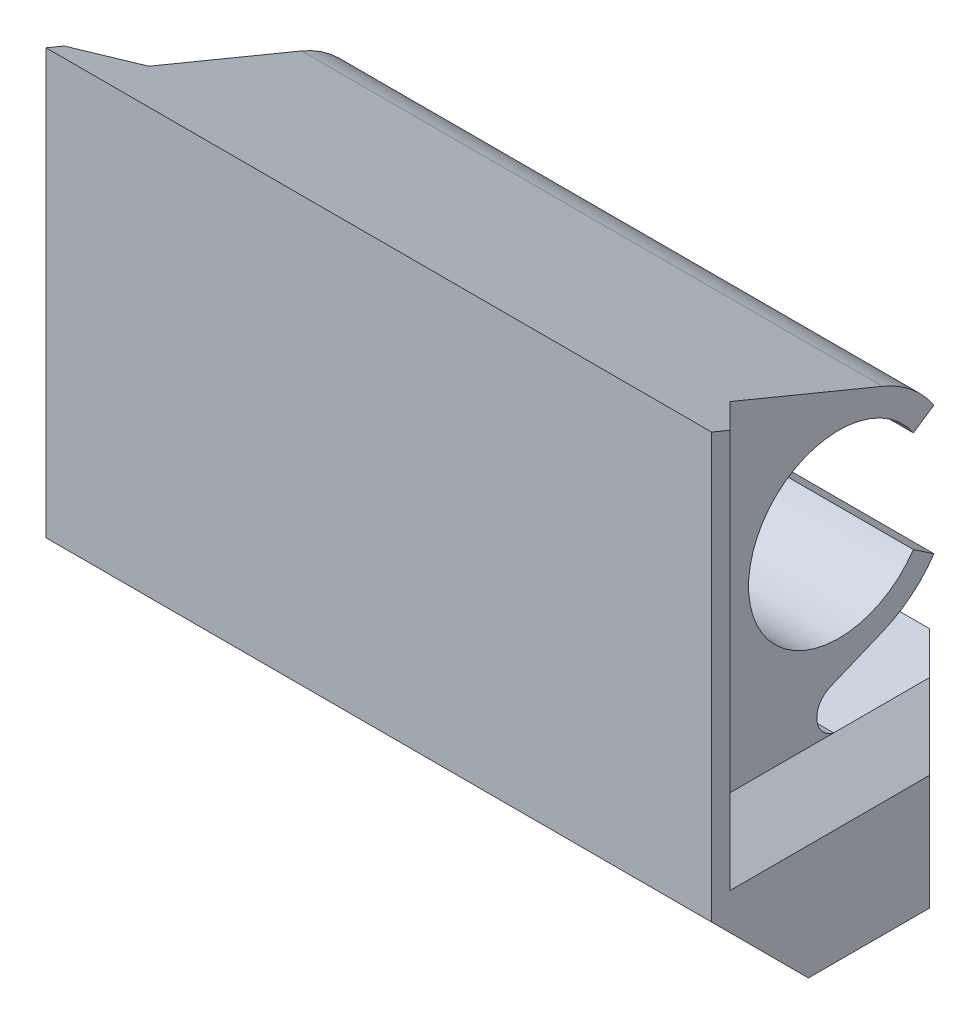
ISO-10303-21;
HEADER;
FILE_DESCRIPTION(('STEP AP214'),'2;1');
FILE_NAME('part.step','',(''),(''),'','','');
FILE_SCHEMA(('AUTOMOTIVE_DESIGN { 1 0 10303 214 1 1 1 1 }'));
ENDSEC;
DATA;
#1=APPLICATION_CONTEXT('core data for automotive mechanical design processes');
#2=APPLICATION_PROTOCOL_DEFINITION('international standard','automotive_design',2000,#1);
#3=PRODUCT_CONTEXT('',#1,'mechanical');
#4=PRODUCT('Part','Part','',(#3));
#5=PRODUCT_RELATED_PRODUCT_CATEGORY('part','',(#4));
#6=PRODUCT_DEFINITION_FORMATION('','',#4);
#7=PRODUCT_DEFINITION_CONTEXT('part definition',#1,'design');
#8=PRODUCT_DEFINITION('design','',#6,#7);
#9=PRODUCT_DEFINITION_SHAPE('','',#8);
#10=(LENGTH_UNIT() NAMED_UNIT(*) SI_UNIT(.MILLI.,.METRE.));
#11=(NAMED_UNIT(*) PLANE_ANGLE_UNIT() SI_UNIT($,.RADIAN.));
#12=(NAMED_UNIT(*) SI_UNIT($,.STERADIAN.) SOLID_ANGLE_UNIT());
#13=UNCERTAINTY_MEASURE_WITH_UNIT(LENGTH_MEASURE(1.E-05),#10,'distance_accuracy_value','');
#14=(GEOMETRIC_REPRESENTATION_CONTEXT(3) GLOBAL_UNCERTAINTY_ASSIGNED_CONTEXT((#13)) GLOBAL_UNIT_ASSIGNED_CONTEXT((#10,
#11,#12)) REPRESENTATION_CONTEXT('',''));
#15=CARTESIAN_POINT('',(0.,0.,0.));
#16=DIRECTION('',(0.,0.,1.));
#17=DIRECTION('',(1.,0.,0.));
#18=AXIS2_PLACEMENT_3D('',#15,#16,#17);
#19=CARTESIAN_POINT('',(41.1457740364154,20.7795206516653,-8.99999999999999));
#20=DIRECTION('',(-1.,0.,0.));
#21=DIRECTION('',(0.,0.,1.));
#22=AXIS2_PLACEMENT_3D('',#19,#20,#21);
#23=CYLINDRICAL_SURFACE('',#22,7.45);
#24=DIRECTION('',(-1.,0.,0.));
#25=VECTOR('',#24,1.);
#26=CARTESIAN_POINT('',(41.1457740364154,16.6055910436871,-15.1709652103738));
#27=LINE('',#26,#25);
#28=CARTESIAN_POINT('',(41.1457740364154,16.6055910436871,-15.1709652103738));
#29=VERTEX_POINT('',#28);
#30=CARTESIAN_POINT('',(-3.85422596358456,16.6055910436871,-15.1709652103738));
#31=VERTEX_POINT('',#30);
#32=EDGE_CURVE('E286',#29,#31,#27,.T.);
#33=ORIENTED_EDGE('',*,*,#32,.T.);
#34=CARTESIAN_POINT('',(-3.85422596358456,20.7795206516653,-8.99999999999999));
#35=DIRECTION('',(-1.,0.,0.));
#36=DIRECTION('',(0.,0.,1.));
#37=AXIS2_PLACEMENT_3D('',#34,#35,#36);
#38=CIRCLE('',#37,7.45);
#39=CARTESIAN_POINT('',(-3.85422596358456,24.9534502596434,-15.1709652103738));
#40=VERTEX_POINT('',#39);
#41=EDGE_CURVE('E198',#31,#40,#38,.T.);
#42=ORIENTED_EDGE('',*,*,#41,.T.);
#43=DIRECTION('',(-1.,0.,0.));
#44=VECTOR('',#43,1.);
#45=CARTESIAN_POINT('',(41.1457740364154,24.9534502596434,-15.1709652103738));
#46=LINE('',#45,#44);
#47=CARTESIAN_POINT('',(41.1457740364154,24.9534502596434,-15.1709652103738));
#48=VERTEX_POINT('',#47);
#49=EDGE_CURVE('E288',#48,#40,#46,.T.);
#50=ORIENTED_EDGE('',*,*,#49,.F.);
#51=CARTESIAN_POINT('',(41.1457740364154,20.7795206516653,-8.99999999999999));
#52=DIRECTION('',(1.,0.,0.));
#53=DIRECTION('',(0.,0.,1.));
#54=AXIS2_PLACEMENT_3D('',#51,#52,#53);
#55=CIRCLE('',#54,7.45);
#56=EDGE_CURVE('E239',#48,#29,#55,.T.);
#57=ORIENTED_EDGE('',*,*,#56,.T.);
#58=EDGE_LOOP('',(#33,#42,#50,#57));
#59=FACE_BOUND('',#58,.T.);
#60=ADVANCED_FACE('F33',(#59),#23,.F.);
#61=CARTESIAN_POINT('',(44.6457740364154,6.77952065166529,-20.));
#62=DIRECTION('',(0.,1.,0.));
#63=DIRECTION('',(0.,0.,1.));
#64=AXIS2_PLACEMENT_3D('',#61,#62,#63);
#65=PLANE('',#64);
#66=DIRECTION('',(0.,0.,-1.));
#67=VECTOR('',#66,1.);
#68=CARTESIAN_POINT('',(41.1457740364154,6.77952065166529,-20.));
#69=LINE('',#68,#67);
#70=CARTESIAN_POINT('',(41.1457740364154,6.77952065166529,-8.5764706950357));
#71=VERTEX_POINT('',#70);
#72=CARTESIAN_POINT('',(41.1457740364154,6.77952065166529,-16.5));
#73=VERTEX_POINT('',#72);
#74=EDGE_CURVE('E348',#71,#73,#69,.T.);
#75=ORIENTED_EDGE('',*,*,#74,.T.);
#76=DIRECTION('',(0.707106781186549,0.,0.707106781186546));
#77=VECTOR('',#76,1.);
#78=CARTESIAN_POINT('',(41.1457740364154,6.77952065166529,-16.5));
#79=LINE('',#78,#77);
#80=CARTESIAN_POINT('',(37.6457740364154,6.77952065166529,-20.));
#81=VERTEX_POINT('',#80);
#82=EDGE_CURVE('E358',#73,#81,#79,.F.);
#83=ORIENTED_EDGE('',*,*,#82,.T.);
#84=DIRECTION('',(-1.,0.,0.));
#85=VECTOR('',#84,1.);
#86=CARTESIAN_POINT('',(44.6457740364154,6.77952065166529,-20.));
#87=LINE('',#86,#85);
#88=CARTESIAN_POINT('',(-3.35422596358456,6.77952065166529,-20.));
#89=VERTEX_POINT('',#88);
#90=EDGE_CURVE('E297',#81,#89,#87,.T.);
#91=ORIENTED_EDGE('',*,*,#90,.T.);
#92=DIRECTION('',(-0.707106781186546,0.,0.707106781186549));
#93=VECTOR('',#92,1.);
#94=CARTESIAN_POINT('',(20.6457740364153,6.77952065166529,-44.));
#95=LINE('',#94,#93);
#96=CARTESIAN_POINT('',(-6.85422596358455,6.77952065166529,-16.5));
#97=VERTEX_POINT('',#96);
#98=EDGE_CURVE('E356',#89,#97,#95,.T.);
#99=ORIENTED_EDGE('',*,*,#98,.T.);
#100=DIRECTION('',(0.,0.,1.));
#101=VECTOR('',#100,1.);
#102=CARTESIAN_POINT('',(-6.85422596358455,6.77952065166529,-20.));
#103=LINE('',#102,#101);
#104=CARTESIAN_POINT('',(-6.85422596358456,6.77952065166529,-8.57647069503573));
#105=VERTEX_POINT('',#104);
#106=EDGE_CURVE('E331',#97,#105,#103,.T.);
#107=ORIENTED_EDGE('',*,*,#106,.T.);
#108=DIRECTION('',(-1.,0.,0.));
#109=VECTOR('',#108,1.);
#110=CARTESIAN_POINT('',(41.1457740364154,6.77952065166528,-8.57647069503573));
#111=LINE('',#110,#109);
#112=EDGE_CURVE('E276',#71,#105,#111,.T.);
#113=ORIENTED_EDGE('',*,*,#112,.F.);
#114=EDGE_LOOP('',(#75,#83,#91,#99,#107,#113));
#115=FACE_BOUND('',#114,.T.);
#116=ADVANCED_FACE('F388',(#115),#65,.T.);
#117=CARTESIAN_POINT('',(-10.3542259635846,-6.22047934833471,5.));
#118=DIRECTION('',(-1.,0.,0.));
#119=DIRECTION('',(0.,0.,1.));
#120=AXIS2_PLACEMENT_3D('',#117,#118,#119);
#121=PLANE('',#120);
#122=DIRECTION('',(0.,0.,-1.));
#123=VECTOR('',#122,1.);
#124=CARTESIAN_POINT('',(-10.3542259635846,3.27952065166527,5.));
#125=LINE('',#124,#123);
#126=CARTESIAN_POINT('',(-10.3542259635846,3.27952065166527,3.50000000000002));
#127=VERTEX_POINT('',#126);
#128=CARTESIAN_POINT('',(-10.3542259635846,3.27952065166527,-13.));
#129=VERTEX_POINT('',#128);
#130=EDGE_CURVE('E335',#127,#129,#125,.T.);
#131=ORIENTED_EDGE('',*,*,#130,.T.);
#132=DIRECTION('',(0.,-1.,0.));
#133=VECTOR('',#132,1.);
#134=CARTESIAN_POINT('',(-10.3542259635846,-6.22047934833471,-13.));
#135=LINE('',#134,#133);
#136=CARTESIAN_POINT('',(-10.3542259635846,-6.22047934833471,-13.));
#137=VERTEX_POINT('',#136);
#138=EDGE_CURVE('E11',#129,#137,#135,.T.);
#139=ORIENTED_EDGE('',*,*,#138,.T.);
#140=DIRECTION('',(0.,0.,-1.));
#141=VECTOR('',#140,1.);
#142=CARTESIAN_POINT('',(-10.3542259635846,-6.22047934833471,5.));
#143=LINE('',#142,#141);
#144=CARTESIAN_POINT('',(-10.3542259635846,-6.22047934833471,-3.00000000000001));
#145=VERTEX_POINT('',#144);
#146=EDGE_CURVE('E318',#145,#137,#143,.T.);
#147=ORIENTED_EDGE('',*,*,#146,.F.);
#148=DIRECTION('',(0.,-0.707106781186546,-0.707106781186549));
#149=VECTOR('',#148,1.);
#150=CARTESIAN_POINT('',(-10.3542259635846,-2.2204793483347,1.00000000000001));
#151=LINE('',#150,#149);
#152=CARTESIAN_POINT('',(-10.3542259635846,1.77952065166527,5.));
#153=VERTEX_POINT('',#152);
#154=EDGE_CURVE('E329',#145,#153,#151,.F.);
#155=ORIENTED_EDGE('',*,*,#154,.T.);
#156=DIRECTION('',(0.,1.,0.));
#157=VECTOR('',#156,1.);
#158=CARTESIAN_POINT('',(-10.3542259635846,-6.22047934833471,5.));
#159=LINE('',#158,#157);
#160=CARTESIAN_POINT('',(-10.3542259635846,36.8463738964464,5.));
#161=VERTEX_POINT('',#160);
#162=EDGE_CURVE('E311',#153,#161,#159,.T.);
#163=ORIENTED_EDGE('',*,*,#162,.T.);
#164=DIRECTION('',(0.,0.382018430191151,0.92415470511938));
#165=VECTOR('',#164,1.);
#166=CARTESIAN_POINT('',(-10.3542259635846,34.7795206516653,0.));
#167=LINE('',#166,#165);
#168=CARTESIAN_POINT('',(-10.3542259635846,36.2263179230121,3.50000000000002));
#169=VERTEX_POINT('',#168);
#170=EDGE_CURVE('E218',#169,#161,#167,.T.);
#171=ORIENTED_EDGE('',*,*,#170,.F.);
#172=DIRECTION('',(0.,-1.,0.));
#173=VECTOR('',#172,1.);
#174=CARTESIAN_POINT('',(-10.3542259635846,-6.22047934833471,3.50000000000002));
#175=LINE('',#174,#173);
#176=EDGE_CURVE('E333',#169,#127,#175,.T.);
#177=ORIENTED_EDGE('',*,*,#176,.T.);
#178=EDGE_LOOP('',(#131,#139,#147,#155,#163,#171,#177));
#179=FACE_BOUND('',#178,.T.);
#180=ADVANCED_FACE('F434',(#179),#121,.T.);
#181=CARTESIAN_POINT('',(-10.3542259635846,-6.22047934833471,5.));
#182=DIRECTION('',(0.,1.,0.));
#183=DIRECTION('',(0.,0.,1.));
#184=AXIS2_PLACEMENT_3D('',#181,#182,#183);
#185=PLANE('',#184);
#186=CARTESIAN_POINT('',(-0.354225963584559,-6.22047934833471,-11.));
#187=DIRECTION('',(0.,-1.,0.));
#188=DIRECTION('',(0.,0.,-1.));
#189=AXIS2_PLACEMENT_3D('',#186,#187,#188);
#190=CIRCLE('',#189,4.5);
#191=CARTESIAN_POINT('',(-0.354225963584559,-6.22047934833471,-15.5));
#192=VERTEX_POINT('',#191);
#193=EDGE_CURVE('E298',#192,#192,#190,.T.);
#194=ORIENTED_EDGE('',*,*,#193,.F.);
#195=EDGE_LOOP('',(#194));
#196=FACE_BOUND('',#195,.T.);
#197=CARTESIAN_POINT('',(34.6457740364154,-6.22047934833471,-11.));
#198=DIRECTION('',(0.,-1.,0.));
#199=DIRECTION('',(0.,0.,-1.));
#200=AXIS2_PLACEMENT_3D('',#197,#198,#199);
#201=CIRCLE('',#200,4.5);
#202=CARTESIAN_POINT('',(34.6457740364154,-6.22047934833471,-15.5));
#203=VERTEX_POINT('',#202);
#204=EDGE_CURVE('E279',#203,#203,#201,.T.);
#205=ORIENTED_EDGE('',*,*,#204,.F.);
#206=EDGE_LOOP('',(#205));
#207=FACE_BOUND('',#206,.T.);
#208=DIRECTION('',(-1.,0.,0.));
#209=VECTOR('',#208,1.);
#210=CARTESIAN_POINT('',(44.6457740364154,-6.22047934833471,-20.));
#211=LINE('',#210,#209);
#212=CARTESIAN_POINT('',(37.6457740364154,-6.22047934833471,-20.));
#213=VERTEX_POINT('',#212);
#214=CARTESIAN_POINT('',(-3.35422596358456,-6.22047934833471,-20.));
#215=VERTEX_POINT('',#214);
#216=EDGE_CURVE('E308',#213,#215,#211,.T.);
#217=ORIENTED_EDGE('',*,*,#216,.F.);
#218=DIRECTION('',(-0.707106781186549,0.,-0.707106781186546));
#219=VECTOR('',#218,1.);
#220=CARTESIAN_POINT('',(44.6457740364154,-6.22047934833471,-13.));
#221=LINE('',#220,#219);
#222=CARTESIAN_POINT('',(44.6457740364154,-6.22047934833471,-13.));
#223=VERTEX_POINT('',#222);
#224=EDGE_CURVE('E367',#213,#223,#221,.F.);
#225=ORIENTED_EDGE('',*,*,#224,.T.);
#226=DIRECTION('',(0.,0.,-1.));
#227=VECTOR('',#226,1.);
#228=CARTESIAN_POINT('',(44.6457740364154,-6.22047934833471,5.));
#229=LINE('',#228,#227);
#230=CARTESIAN_POINT('',(44.6457740364154,-6.22047934833471,-3.00000000000001));
#231=VERTEX_POINT('',#230);
#232=EDGE_CURVE('E317',#231,#223,#229,.T.);
#233=ORIENTED_EDGE('',*,*,#232,.F.);
#234=DIRECTION('',(-1.,0.,0.));
#235=VECTOR('',#234,1.);
#236=CARTESIAN_POINT('',(-10.3542259635846,-6.22047934833471,-3.00000000000001));
#237=LINE('',#236,#235);
#238=EDGE_CURVE('E327',#231,#145,#237,.T.);
#239=ORIENTED_EDGE('',*,*,#238,.T.);
#240=ORIENTED_EDGE('',*,*,#146,.T.);
#241=DIRECTION('',(0.707106781186546,0.,-0.707106781186549));
#242=VECTOR('',#241,1.);
#243=CARTESIAN_POINT('',(-3.35422596358457,-6.22047934833471,-20.));
#244=LINE('',#243,#242);
#245=EDGE_CURVE('E365',#137,#215,#244,.T.);
#246=ORIENTED_EDGE('',*,*,#245,.T.);
#247=EDGE_LOOP('',(#217,#225,#233,#239,#240,#246));
#248=FACE_BOUND('',#247,.T.);
#249=ADVANCED_FACE('F372',(#196,#207,#248),#185,.F.);
#250=CARTESIAN_POINT('',(44.6457740364154,-6.22047934833471,5.));
#251=DIRECTION('',(-1.,0.,0.));
#252=DIRECTION('',(0.,0.,1.));
#253=AXIS2_PLACEMENT_3D('',#250,#251,#252);
#254=PLANE('',#253);
#255=ORIENTED_EDGE('',*,*,#232,.T.);
#256=DIRECTION('',(0.,1.,0.));
#257=VECTOR('',#256,1.);
#258=CARTESIAN_POINT('',(44.6457740364154,-6.22047934833471,-13.));
#259=LINE('',#258,#257);
#260=CARTESIAN_POINT('',(44.6457740364154,3.27952065166529,-13.));
#261=VERTEX_POINT('',#260);
#262=EDGE_CURVE('E350',#223,#261,#259,.T.);
#263=ORIENTED_EDGE('',*,*,#262,.T.);
#264=DIRECTION('',(0.,0.,1.));
#265=VECTOR('',#264,1.);
#266=CARTESIAN_POINT('',(44.6457740364154,3.27952065166529,0.));
#267=LINE('',#266,#265);
#268=CARTESIAN_POINT('',(44.6457740364154,3.27952065166529,3.5));
#269=VERTEX_POINT('',#268);
#270=EDGE_CURVE('E339',#261,#269,#267,.T.);
#271=ORIENTED_EDGE('',*,*,#270,.T.);
#272=DIRECTION('',(0.,1.,0.));
#273=VECTOR('',#272,1.);
#274=CARTESIAN_POINT('',(44.6457740364154,34.7795206516653,3.5));
#275=LINE('',#274,#273);
#276=CARTESIAN_POINT('',(44.6457740364154,36.2263179230121,3.5));
#277=VERTEX_POINT('',#276);
#278=EDGE_CURVE('E343',#269,#277,#275,.T.);
#279=ORIENTED_EDGE('',*,*,#278,.T.);
#280=DIRECTION('',(0.,0.382018430191151,0.92415470511938));
#281=VECTOR('',#280,1.);
#282=CARTESIAN_POINT('',(44.6457740364154,34.7795206516653,0.));
#283=LINE('',#282,#281);
#284=CARTESIAN_POINT('',(44.6457740364154,36.8463738964464,5.));
#285=VERTEX_POINT('',#284);
#286=EDGE_CURVE('E215',#277,#285,#283,.T.);
#287=ORIENTED_EDGE('',*,*,#286,.T.);
#288=DIRECTION('',(0.,1.,0.));
#289=VECTOR('',#288,1.);
#290=CARTESIAN_POINT('',(44.6457740364154,-6.22047934833471,5.));
#291=LINE('',#290,#289);
#292=CARTESIAN_POINT('',(44.6457740364154,1.77952065166527,5.));
#293=VERTEX_POINT('',#292);
#294=EDGE_CURVE('E314',#293,#285,#291,.T.);
#295=ORIENTED_EDGE('',*,*,#294,.F.);
#296=DIRECTION('',(0.,0.707106781186546,0.707106781186549));
#297=VECTOR('',#296,1.);
#298=CARTESIAN_POINT('',(44.6457740364154,1.77952065166528,5.));
#299=LINE('',#298,#297);
#300=EDGE_CURVE('E325',#293,#231,#299,.F.);
#301=ORIENTED_EDGE('',*,*,#300,.T.);
#302=EDGE_LOOP('',(#255,#263,#271,#279,#287,#295,#301));
#303=FACE_BOUND('',#302,.T.);
#304=ADVANCED_FACE('F378',(#303),#254,.F.);
#305=CARTESIAN_POINT('',(0.,0.,5.));
#306=DIRECTION('',(0.,0.,-1.));
#307=DIRECTION('',(-1.,0.,0.));
#308=AXIS2_PLACEMENT_3D('',#305,#306,#307);
#309=PLANE('',#308);
#310=ORIENTED_EDGE('',*,*,#294,.T.);
#311=DIRECTION('',(-1.,0.,0.));
#312=VECTOR('',#311,1.);
#313=CARTESIAN_POINT('',(44.6457740364154,36.8463738964464,5.));
#314=LINE('',#313,#312);
#315=EDGE_CURVE('E217',#285,#161,#314,.T.);
#316=ORIENTED_EDGE('',*,*,#315,.T.);
#317=ORIENTED_EDGE('',*,*,#162,.F.);
#318=DIRECTION('',(1.,0.,0.));
#319=VECTOR('',#318,1.);
#320=CARTESIAN_POINT('',(0.,1.77952065166528,5.));
#321=LINE('',#320,#319);
#322=EDGE_CURVE('E320',#153,#293,#321,.T.);
#323=ORIENTED_EDGE('',*,*,#322,.T.);
#324=EDGE_LOOP('',(#310,#316,#317,#323));
#325=FACE_BOUND('',#324,.T.);
#326=ADVANCED_FACE('F428',(#325),#309,.F.);
#327=CARTESIAN_POINT('',(0.,0.,-20.));
#328=DIRECTION('',(0.,0.,1.));
#329=DIRECTION('',(1.,0.,0.));
#330=AXIS2_PLACEMENT_3D('',#327,#328,#329);
#331=PLANE('',#330);
#332=ORIENTED_EDGE('',*,*,#90,.F.);
#333=DIRECTION('',(0.,-1.,0.));
#334=VECTOR('',#333,1.);
#335=CARTESIAN_POINT('',(37.6457740364154,0.,-20.));
#336=LINE('',#335,#334);
#337=EDGE_CURVE('E363',#81,#213,#336,.T.);
#338=ORIENTED_EDGE('',*,*,#337,.T.);
#339=ORIENTED_EDGE('',*,*,#216,.T.);
#340=DIRECTION('',(0.,1.,0.));
#341=VECTOR('',#340,1.);
#342=CARTESIAN_POINT('',(-3.35422596358457,3.27952065166527,-20.));
#343=LINE('',#342,#341);
#344=EDGE_CURVE('E360',#215,#89,#343,.T.);
#345=ORIENTED_EDGE('',*,*,#344,.T.);
#346=EDGE_LOOP('',(#332,#338,#339,#345));
#347=FACE_BOUND('',#346,.T.);
#348=ADVANCED_FACE('F445',(#347),#331,.F.);
#349=CARTESIAN_POINT('',(0.,1.77952065166528,5.));
#350=DIRECTION('',(0.,0.707106781186549,-0.707106781186546));
#351=DIRECTION('',(1.,0.,0.));
#352=AXIS2_PLACEMENT_3D('',#349,#350,#351);
#353=PLANE('',#352);
#354=ORIENTED_EDGE('',*,*,#154,.F.);
#355=ORIENTED_EDGE('',*,*,#238,.F.);
#356=ORIENTED_EDGE('',*,*,#300,.F.);
#357=ORIENTED_EDGE('',*,*,#322,.F.);
#358=EDGE_LOOP('',(#354,#355,#356,#357));
#359=FACE_BOUND('',#358,.T.);
#360=ADVANCED_FACE('F432',(#359),#353,.F.);
#361=CARTESIAN_POINT('',(34.6457740364154,1.77952065166529,-11.));
#362=DIRECTION('',(0.,-1.,0.));
#363=DIRECTION('',(0.,0.,-1.));
#364=AXIS2_PLACEMENT_3D('',#361,#362,#363);
#365=CYLINDRICAL_SURFACE('',#364,4.5);
#366=CARTESIAN_POINT('',(34.6457740364154,1.77952065166529,-11.));
#367=DIRECTION('',(0.,-1.,0.));
#368=DIRECTION('',(0.,0.,-1.));
#369=AXIS2_PLACEMENT_3D('',#366,#367,#368);
#370=CIRCLE('',#369,4.5);
#371=CARTESIAN_POINT('',(34.6457740364154,1.77952065166529,-15.5));
#372=VERTEX_POINT('',#371);
#373=EDGE_CURVE('E301',#372,#372,#370,.T.);
#374=ORIENTED_EDGE('',*,*,#373,.F.);
#375=EDGE_LOOP('',(#374));
#376=FACE_BOUND('',#375,.T.);
#377=ORIENTED_EDGE('',*,*,#204,.T.);
#378=EDGE_LOOP('',(#377));
#379=FACE_BOUND('',#378,.T.);
#380=ADVANCED_FACE('F452',(#376,#379),#365,.F.);
#381=CARTESIAN_POINT('',(34.6457740364154,1.77952065166529,-11.));
#382=DIRECTION('',(0.,-1.,0.));
#383=DIRECTION('',(0.,0.,-1.));
#384=AXIS2_PLACEMENT_3D('',#381,#382,#383);
#385=PLANE('',#384);
#386=ORIENTED_EDGE('',*,*,#373,.T.);
#387=EDGE_LOOP('',(#386));
#388=FACE_BOUND('',#387,.T.);
#389=ADVANCED_FACE('F480',(#388),#385,.T.);
#390=CARTESIAN_POINT('',(-0.354225963584559,1.77952065166529,-11.));
#391=DIRECTION('',(0.,-1.,0.));
#392=DIRECTION('',(0.,0.,-1.));
#393=AXIS2_PLACEMENT_3D('',#390,#391,#392);
#394=CYLINDRICAL_SURFACE('',#393,4.5);
#395=CARTESIAN_POINT('',(-0.354225963584559,1.77952065166529,-11.));
#396=DIRECTION('',(0.,-1.,0.));
#397=DIRECTION('',(0.,0.,-1.));
#398=AXIS2_PLACEMENT_3D('',#395,#396,#397);
#399=CIRCLE('',#398,4.5);
#400=CARTESIAN_POINT('',(-0.354225963584559,1.77952065166529,-15.5));
#401=VERTEX_POINT('',#400);
#402=EDGE_CURVE('E294',#401,#401,#399,.T.);
#403=ORIENTED_EDGE('',*,*,#402,.F.);
#404=EDGE_LOOP('',(#403));
#405=FACE_BOUND('',#404,.T.);
#406=ORIENTED_EDGE('',*,*,#193,.T.);
#407=EDGE_LOOP('',(#406));
#408=FACE_BOUND('',#407,.T.);
#409=ADVANCED_FACE('F476',(#405,#408),#394,.F.);
#410=CARTESIAN_POINT('',(-0.354225963584559,1.77952065166529,-11.));
#411=DIRECTION('',(0.,-1.,0.));
#412=DIRECTION('',(0.,0.,-1.));
#413=AXIS2_PLACEMENT_3D('',#410,#411,#412);
#414=PLANE('',#413);
#415=ORIENTED_EDGE('',*,*,#402,.T.);
#416=EDGE_LOOP('',(#415));
#417=FACE_BOUND('',#416,.T.);
#418=ADVANCED_FACE('F473',(#417),#414,.T.);
#419=CARTESIAN_POINT('',(41.1457740364154,8.54026485817867,-8.99999999999999));
#420=DIRECTION('',(-1.,0.,0.));
#421=DIRECTION('',(0.,0.,1.));
#422=AXIS2_PLACEMENT_3D('',#419,#420,#421);
#423=CYLINDRICAL_SURFACE('',#422,1.81096582875933);
#424=CARTESIAN_POINT('',(-6.85422596358456,8.54026485817867,-8.99999999999999));
#425=DIRECTION('',(1.,0.,0.));
#426=DIRECTION('',(0.,0.,1.));
#427=AXIS2_PLACEMENT_3D('',#424,#425,#426);
#428=CIRCLE('',#427,1.81096582875933);
#429=CARTESIAN_POINT('',(-6.85422596358456,10.213877449637,-8.30817767696753));
#430=VERTEX_POINT('',#429);
#431=EDGE_CURVE('E227',#430,#105,#428,.T.);
#432=ORIENTED_EDGE('',*,*,#431,.F.);
#433=DIRECTION('',(-1.,0.,0.));
#434=VECTOR('',#433,1.);
#435=CARTESIAN_POINT('',(41.1457740364154,10.213877449637,-8.30817767696753));
#436=LINE('',#435,#434);
#437=CARTESIAN_POINT('',(41.1457740364154,10.213877449637,-8.30817767696753));
#438=VERTEX_POINT('',#437);
#439=EDGE_CURVE('E280',#438,#430,#436,.T.);
#440=ORIENTED_EDGE('',*,*,#439,.F.);
#441=CARTESIAN_POINT('',(41.1457740364154,8.54026485817867,-8.99999999999999));
#442=DIRECTION('',(1.,0.,0.));
#443=DIRECTION('',(0.,0.,1.));
#444=AXIS2_PLACEMENT_3D('',#441,#442,#443);
#445=CIRCLE('',#444,1.81096582875933);
#446=EDGE_CURVE('E251',#438,#71,#445,.T.);
#447=ORIENTED_EDGE('',*,*,#446,.T.);
#448=ORIENTED_EDGE('',*,*,#112,.T.);
#449=EDGE_LOOP('',(#432,#440,#447,#448));
#450=FACE_BOUND('',#449,.T.);
#451=ADVANCED_FACE('F399',(#450),#423,.F.);
#452=CARTESIAN_POINT('',(41.1457740364154,10.213877449637,-8.30817767696753));
#453=DIRECTION('',(0.,-0.924154705119381,-0.382018430191149));
#454=DIRECTION('',(0.,0.382018430191149,-0.924154705119381));
#455=AXIS2_PLACEMENT_3D('',#452,#453,#454);
#456=PLANE('',#455);
#457=DIRECTION('',(0.,-0.382018430191149,0.924154705119381));
#458=VECTOR('',#457,1.);
#459=CARTESIAN_POINT('',(-6.85422596358456,10.213877449637,-8.30817767696753));
#460=LINE('',#459,#458);
#461=CARTESIAN_POINT('',(-6.85422596358456,12.0000509530765,-12.6291750867972));
#462=VERTEX_POINT('',#461);
#463=EDGE_CURVE('E271',#462,#430,#460,.T.);
#464=ORIENTED_EDGE('',*,*,#463,.F.);
#465=DIRECTION('',(-1.,0.,0.));
#466=VECTOR('',#465,1.);
#467=CARTESIAN_POINT('',(41.1457740364154,12.0000509530765,-12.6291750867972));
#468=LINE('',#467,#466);
#469=CARTESIAN_POINT('',(41.1457740364154,12.0000509530765,-12.6291750867972));
#470=VERTEX_POINT('',#469);
#471=EDGE_CURVE('E282',#470,#462,#468,.T.);
#472=ORIENTED_EDGE('',*,*,#471,.F.);
#473=DIRECTION('',(0.,-0.382018430191149,0.924154705119381));
#474=VECTOR('',#473,1.);
#475=CARTESIAN_POINT('',(41.1457740364154,10.213877449637,-8.30817767696753));
#476=LINE('',#475,#474);
#477=EDGE_CURVE('E248',#470,#438,#476,.T.);
#478=ORIENTED_EDGE('',*,*,#477,.T.);
#479=ORIENTED_EDGE('',*,*,#439,.T.);
#480=EDGE_LOOP('',(#464,#472,#478,#479));
#481=FACE_BOUND('',#480,.T.);
#482=ADVANCED_FACE('F402',(#481),#456,.T.);
#483=CARTESIAN_POINT('',(41.1457740364154,20.7795206516653,-8.99999999999999));
#484=DIRECTION('',(-1.,0.,0.));
#485=DIRECTION('',(0.,0.,1.));
#486=AXIS2_PLACEMENT_3D('',#483,#484,#485);
#487=CYLINDRICAL_SURFACE('',#486,9.49999999995097);
#488=CARTESIAN_POINT('',(-6.85422596358456,20.7795206516653,-8.99999999999999));
#489=DIRECTION('',(-1.,0.,0.));
#490=DIRECTION('',(0.,0.,1.));
#491=AXIS2_PLACEMENT_3D('',#488,#489,#490);
#492=CIRCLE('',#491,9.49999999995097);
#493=CARTESIAN_POINT('',(-6.85422596358456,15.4570600777609,-16.8690160400333));
#494=VERTEX_POINT('',#493);
#495=EDGE_CURVE('E268',#494,#462,#492,.T.);
#496=ORIENTED_EDGE('',*,*,#495,.F.);
#497=DIRECTION('',(-1.,0.,0.));
#498=VECTOR('',#497,1.);
#499=CARTESIAN_POINT('',(41.1457740364154,15.4570600777609,-16.8690160400333));
#500=LINE('',#499,#498);
#501=CARTESIAN_POINT('',(41.1457740364154,15.4570600777609,-16.8690160400333));
#502=VERTEX_POINT('',#501);
#503=EDGE_CURVE('E284',#502,#494,#500,.T.);
#504=ORIENTED_EDGE('',*,*,#503,.F.);
#505=CARTESIAN_POINT('',(41.1457740364154,20.7795206516653,-8.99999999999999));
#506=DIRECTION('',(-1.,0.,0.));
#507=DIRECTION('',(0.,0.,1.));
#508=AXIS2_PLACEMENT_3D('',#505,#506,#507);
#509=CIRCLE('',#508,9.49999999995097);
#510=EDGE_CURVE('E245',#502,#470,#509,.T.);
#511=ORIENTED_EDGE('',*,*,#510,.T.);
#512=ORIENTED_EDGE('',*,*,#471,.T.);
#513=EDGE_LOOP('',(#496,#504,#511,#512));
#514=FACE_BOUND('',#513,.T.);
#515=ADVANCED_FACE('F407',(#514),#487,.T.);
#516=CARTESIAN_POINT('',(41.1457740364154,16.6055910436871,-15.1709652103738));
#517=DIRECTION('',(0.,0.82831747790252,-0.560259007782301));
#518=DIRECTION('',(0.,0.560259007782301,0.82831747790252));
#519=AXIS2_PLACEMENT_3D('',#516,#517,#518);
#520=PLANE('',#519);
#521=DIRECTION('',(0.,-0.560259007782301,-0.82831747790252));
#522=VECTOR('',#521,1.);
#523=CARTESIAN_POINT('',(-6.85422596358456,16.6055910436871,-15.1709652103738));
#524=LINE('',#523,#522);
#525=CARTESIAN_POINT('',(-6.85422596358456,18.5384846205361,-12.3132699116101));
#526=VERTEX_POINT('',#525);
#527=EDGE_CURVE('E205',#526,#494,#524,.T.);
#528=ORIENTED_EDGE('',*,*,#527,.F.);
#529=DIRECTION('',(-1.,0.,0.));
#530=VECTOR('',#529,1.);
#531=CARTESIAN_POINT('',(-3.85422596358456,18.5384846205361,-12.3132699116101));
#532=LINE('',#531,#530);
#533=CARTESIAN_POINT('',(-3.85422596358456,18.5384846205361,-12.3132699116101));
#534=VERTEX_POINT('',#533);
#535=EDGE_CURVE('E187',#534,#526,#532,.T.);
#536=ORIENTED_EDGE('',*,*,#535,.F.);
#537=DIRECTION('',(0.,0.560259007782301,0.82831747790252));
#538=VECTOR('',#537,1.);
#539=CARTESIAN_POINT('',(-3.85422596358456,16.6055910436871,-15.1709652103738));
#540=LINE('',#539,#538);
#541=EDGE_CURVE('E193',#31,#534,#540,.T.);
#542=ORIENTED_EDGE('',*,*,#541,.F.);
#543=ORIENTED_EDGE('',*,*,#32,.F.);
#544=DIRECTION('',(0.,-0.560259007782301,-0.82831747790252));
#545=VECTOR('',#544,1.);
#546=CARTESIAN_POINT('',(41.1457740364154,16.6055910436871,-15.1709652103738));
#547=LINE('',#546,#545);
#548=EDGE_CURVE('E242',#29,#502,#547,.T.);
#549=ORIENTED_EDGE('',*,*,#548,.T.);
#550=ORIENTED_EDGE('',*,*,#503,.T.);
#551=EDGE_LOOP('',(#528,#536,#542,#543,#549,#550));
#552=FACE_BOUND('',#551,.T.);
#553=ADVANCED_FACE('F203',(#552),#520,.T.);
#554=CARTESIAN_POINT('',(41.1457740364154,24.9534502596434,-15.1709652103738));
#555=DIRECTION('',(0.,-0.82831747790252,-0.560259007782301));
#556=DIRECTION('',(0.,0.560259007782301,-0.82831747790252));
#557=AXIS2_PLACEMENT_3D('',#554,#555,#556);
#558=PLANE('',#557);
#559=DIRECTION('',(0.,-0.560259007782301,0.82831747790252));
#560=VECTOR('',#559,1.);
#561=CARTESIAN_POINT('',(-6.85422596358456,24.9534502596434,-15.1709652103738));
#562=LINE('',#561,#560);
#563=CARTESIAN_POINT('',(-6.85422596358456,26.1019812255697,-16.8690160400333));
#564=VERTEX_POINT('',#563);
#565=CARTESIAN_POINT('',(-6.85422596358456,23.0205566827945,-12.3132699116101));
#566=VERTEX_POINT('',#565);
#567=EDGE_CURVE('E265',#564,#566,#562,.T.);
#568=ORIENTED_EDGE('',*,*,#567,.F.);
#569=DIRECTION('',(-1.,0.,0.));
#570=VECTOR('',#569,1.);
#571=CARTESIAN_POINT('',(41.1457740364154,26.1019812255697,-16.8690160400333));
#572=LINE('',#571,#570);
#573=CARTESIAN_POINT('',(41.1457740364154,26.1019812255697,-16.8690160400333));
#574=VERTEX_POINT('',#573);
#575=EDGE_CURVE('E291',#574,#564,#572,.T.);
#576=ORIENTED_EDGE('',*,*,#575,.F.);
#577=DIRECTION('',(0.,-0.560259007782301,0.82831747790252));
#578=VECTOR('',#577,1.);
#579=CARTESIAN_POINT('',(41.1457740364154,24.9534502596434,-15.1709652103738));
#580=LINE('',#579,#578);
#581=EDGE_CURVE('E236',#574,#48,#580,.T.);
#582=ORIENTED_EDGE('',*,*,#581,.T.);
#583=ORIENTED_EDGE('',*,*,#49,.T.);
#584=DIRECTION('',(0.,-0.560259007782301,0.82831747790252));
#585=VECTOR('',#584,1.);
#586=CARTESIAN_POINT('',(-3.85422596358456,24.9534502596434,-15.1709652103738));
#587=LINE('',#586,#585);
#588=CARTESIAN_POINT('',(-3.85422596358456,23.0205566827945,-12.3132699116101));
#589=VERTEX_POINT('',#588);
#590=EDGE_CURVE('E192',#40,#589,#587,.T.);
#591=ORIENTED_EDGE('',*,*,#590,.T.);
#592=DIRECTION('',(-1.,0.,0.));
#593=VECTOR('',#592,1.);
#594=CARTESIAN_POINT('',(-3.85422596358456,23.0205566827945,-12.3132699116101));
#595=LINE('',#594,#593);
#596=EDGE_CURVE('E189',#589,#566,#595,.T.);
#597=ORIENTED_EDGE('',*,*,#596,.T.);
#598=EDGE_LOOP('',(#568,#576,#582,#583,#591,#597));
#599=FACE_BOUND('',#598,.T.);
#600=ADVANCED_FACE('F413',(#599),#558,.T.);
#601=CARTESIAN_POINT('',(41.1457740364154,20.7795206516653,-8.99999999999999));
#602=DIRECTION('',(-1.,0.,0.));
#603=DIRECTION('',(0.,0.,1.));
#604=AXIS2_PLACEMENT_3D('',#601,#602,#603);
#605=CYLINDRICAL_SURFACE('',#604,9.49999999995097);
#606=CARTESIAN_POINT('',(-6.85422596358456,20.7795206516653,-8.99999999999999));
#607=DIRECTION('',(-1.,0.,0.));
#608=DIRECTION('',(0.,0.,1.));
#609=AXIS2_PLACEMENT_3D('',#606,#607,#608);
#610=CIRCLE('',#609,9.49999999995097);
#611=CARTESIAN_POINT('',(-6.85422596358456,29.5589903502541,-12.6291750867972));
#612=VERTEX_POINT('',#611);
#613=EDGE_CURVE('E262',#612,#564,#610,.T.);
#614=ORIENTED_EDGE('',*,*,#613,.F.);
#615=DIRECTION('',(-1.,0.,0.));
#616=VECTOR('',#615,1.);
#617=CARTESIAN_POINT('',(41.1457740364154,29.5589903502541,-12.6291750867972));
#618=LINE('',#617,#616);
#619=CARTESIAN_POINT('',(41.1457740364154,29.5589903502541,-12.6291750867972));
#620=VERTEX_POINT('',#619);
#621=EDGE_CURVE('E254',#620,#612,#618,.T.);
#622=ORIENTED_EDGE('',*,*,#621,.F.);
#623=CARTESIAN_POINT('',(41.1457740364154,20.7795206516653,-8.99999999999999));
#624=DIRECTION('',(-1.,0.,0.));
#625=DIRECTION('',(0.,0.,1.));
#626=AXIS2_PLACEMENT_3D('',#623,#624,#625);
#627=CIRCLE('',#626,9.49999999995097);
#628=EDGE_CURVE('E233',#620,#574,#627,.T.);
#629=ORIENTED_EDGE('',*,*,#628,.T.);
#630=ORIENTED_EDGE('',*,*,#575,.T.);
#631=EDGE_LOOP('',(#614,#622,#629,#630));
#632=FACE_BOUND('',#631,.T.);
#633=ADVANCED_FACE('F417',(#632),#605,.T.);
#634=CARTESIAN_POINT('',(41.1457740364154,34.7795206516653,0.));
#635=DIRECTION('',(0.,0.92415470511938,-0.382018430191152));
#636=DIRECTION('',(0.,0.382018430191152,0.92415470511938));
#637=AXIS2_PLACEMENT_3D('',#634,#635,#636);
#638=PLANE('',#637);
#639=ORIENTED_EDGE('',*,*,#286,.F.);
#640=DIRECTION('',(-0.678707365054248,-0.280557703943846,-0.678707365054245));
#641=VECTOR('',#640,1.);
#642=CARTESIAN_POINT('',(41.1457740364154,34.7795206516653,0.));
#643=LINE('',#642,#641);
#644=CARTESIAN_POINT('',(41.1457740364154,34.7795206516653,0.));
#645=VERTEX_POINT('',#644);
#646=EDGE_CURVE('E346',#277,#645,#643,.T.);
#647=ORIENTED_EDGE('',*,*,#646,.T.);
#648=DIRECTION('',(0.,-0.382018430191152,-0.92415470511938));
#649=VECTOR('',#648,1.);
#650=CARTESIAN_POINT('',(41.1457740364154,34.7795206516653,0.));
#651=LINE('',#650,#649);
#652=EDGE_CURVE('E230',#645,#620,#651,.T.);
#653=ORIENTED_EDGE('',*,*,#652,.T.);
#654=ORIENTED_EDGE('',*,*,#621,.T.);
#655=DIRECTION('',(0.,-0.382018430191152,-0.92415470511938));
#656=VECTOR('',#655,1.);
#657=CARTESIAN_POINT('',(-6.85422596358456,34.7795206516653,0.));
#658=LINE('',#657,#656);
#659=CARTESIAN_POINT('',(-6.85422596358456,34.7795206516653,0.));
#660=VERTEX_POINT('',#659);
#661=EDGE_CURVE('E259',#660,#612,#658,.T.);
#662=ORIENTED_EDGE('',*,*,#661,.F.);
#663=DIRECTION('',(0.678707365054245,-0.280557703943847,-0.678707365054248));
#664=VECTOR('',#663,1.);
#665=CARTESIAN_POINT('',(15.2566710306015,25.6395248121742,-22.1108969941862));
#666=LINE('',#665,#664);
#667=EDGE_CURVE('E337',#660,#169,#666,.F.);
#668=ORIENTED_EDGE('',*,*,#667,.T.);
#669=ORIENTED_EDGE('',*,*,#170,.T.);
#670=ORIENTED_EDGE('',*,*,#315,.F.);
#671=EDGE_LOOP('',(#639,#647,#653,#654,#662,#668,#669,#670));
#672=FACE_BOUND('',#671,.T.);
#673=ADVANCED_FACE('F420',(#672),#638,.T.);
#674=CARTESIAN_POINT('',(41.1457740364154,8.54026485817867,-8.99999999999999));
#675=DIRECTION('',(-1.,0.,0.));
#676=DIRECTION('',(0.,0.,1.));
#677=AXIS2_PLACEMENT_3D('',#674,#675,#676);
#678=PLANE('',#677);
#679=DIRECTION('',(0.,0.,1.));
#680=VECTOR('',#679,1.);
#681=CARTESIAN_POINT('',(41.1457740364154,6.77952065166529,0.));
#682=LINE('',#681,#680);
#683=CARTESIAN_POINT('',(41.1457740364154,6.77952065166529,0.));
#684=VERTEX_POINT('',#683);
#685=EDGE_CURVE('E223',#71,#684,#682,.T.);
#686=ORIENTED_EDGE('',*,*,#685,.F.);
#687=ORIENTED_EDGE('',*,*,#446,.F.);
#688=ORIENTED_EDGE('',*,*,#477,.F.);
#689=ORIENTED_EDGE('',*,*,#510,.F.);
#690=ORIENTED_EDGE('',*,*,#548,.F.);
#691=ORIENTED_EDGE('',*,*,#56,.F.);
#692=ORIENTED_EDGE('',*,*,#581,.F.);
#693=ORIENTED_EDGE('',*,*,#628,.F.);
#694=ORIENTED_EDGE('',*,*,#652,.F.);
#695=DIRECTION('',(0.,1.,0.));
#696=VECTOR('',#695,1.);
#697=CARTESIAN_POINT('',(41.1457740364154,34.7795206516653,0.));
#698=LINE('',#697,#696);
#699=EDGE_CURVE('E226',#684,#645,#698,.T.);
#700=ORIENTED_EDGE('',*,*,#699,.F.);
#701=EDGE_LOOP('',(#686,#687,#688,#689,#690,#691,#692,#693,#694,#700));
#702=FACE_BOUND('',#701,.T.);
#703=ADVANCED_FACE('F396',(#702),#678,.F.);
#704=CARTESIAN_POINT('',(-6.85422596358456,8.54026485817867,-8.99999999999999));
#705=DIRECTION('',(-1.,0.,0.));
#706=DIRECTION('',(0.,0.,1.));
#707=AXIS2_PLACEMENT_3D('',#704,#705,#706);
#708=PLANE('',#707);
#709=DIRECTION('',(0.,0.,1.));
#710=VECTOR('',#709,1.);
#711=CARTESIAN_POINT('',(-6.85422596358456,6.77952065166529,0.));
#712=LINE('',#711,#710);
#713=CARTESIAN_POINT('',(-6.85422596358456,6.77952065166529,0.));
#714=VERTEX_POINT('',#713);
#715=EDGE_CURVE('E222',#105,#714,#712,.T.);
#716=ORIENTED_EDGE('',*,*,#715,.T.);
#717=DIRECTION('',(0.,1.,0.));
#718=VECTOR('',#717,1.);
#719=CARTESIAN_POINT('',(-6.85422596358456,34.7795206516653,0.));
#720=LINE('',#719,#718);
#721=EDGE_CURVE('E256',#714,#660,#720,.T.);
#722=ORIENTED_EDGE('',*,*,#721,.T.);
#723=ORIENTED_EDGE('',*,*,#661,.T.);
#724=ORIENTED_EDGE('',*,*,#613,.T.);
#725=ORIENTED_EDGE('',*,*,#567,.T.);
#726=CARTESIAN_POINT('',(-6.85422596358456,20.7795206516653,-8.99999999999999));
#727=DIRECTION('',(-1.,0.,0.));
#728=DIRECTION('',(0.,0.,1.));
#729=AXIS2_PLACEMENT_3D('',#726,#727,#728);
#730=CIRCLE('',#729,4.);
#731=EDGE_CURVE('E201',#526,#566,#730,.T.);
#732=ORIENTED_EDGE('',*,*,#731,.F.);
#733=ORIENTED_EDGE('',*,*,#527,.T.);
#734=ORIENTED_EDGE('',*,*,#495,.T.);
#735=ORIENTED_EDGE('',*,*,#463,.T.);
#736=ORIENTED_EDGE('',*,*,#431,.T.);
#737=EDGE_LOOP('',(#716,#722,#723,#724,#725,#732,#733,#734,#735,#736));
#738=FACE_BOUND('',#737,.T.);
#739=ADVANCED_FACE('F507',(#738),#708,.T.);
#740=CARTESIAN_POINT('',(-6.85422596358455,0.,0.));
#741=DIRECTION('',(0.707106781186549,0.,0.707106781186546));
#742=DIRECTION('',(0.,1.,0.));
#743=AXIS2_PLACEMENT_3D('',#740,#741,#742);
#744=PLANE('',#743);
#745=ORIENTED_EDGE('',*,*,#667,.F.);
#746=ORIENTED_EDGE('',*,*,#721,.F.);
#747=DIRECTION('',(-0.577350269189625,-0.577350269189626,0.577350269189627));
#748=VECTOR('',#747,1.);
#749=CARTESIAN_POINT('',(-0.18755929691789,13.446187318332,-6.66666666666669));
#750=LINE('',#749,#748);
#751=EDGE_CURVE('E210',#127,#714,#750,.F.);
#752=ORIENTED_EDGE('',*,*,#751,.F.);
#753=ORIENTED_EDGE('',*,*,#176,.F.);
#754=EDGE_LOOP('',(#745,#746,#752,#753));
#755=FACE_BOUND('',#754,.T.);
#756=ADVANCED_FACE('F439',(#755),#744,.F.);
#757=CARTESIAN_POINT('',(-6.85422596358455,6.77952065166529,-20.));
#758=DIRECTION('',(0.707106781186549,-0.707106781186547,0.));
#759=DIRECTION('',(0.,0.,1.));
#760=AXIS2_PLACEMENT_3D('',#757,#758,#759);
#761=PLANE('',#760);
#762=ORIENTED_EDGE('',*,*,#106,.F.);
#763=DIRECTION('',(0.577350269189625,0.577350269189626,-0.577350269189627));
#764=VECTOR('',#763,1.);
#765=CARTESIAN_POINT('',(-5.68755929691789,7.94618731833196,-17.6666666666667));
#766=LINE('',#765,#764);
#767=EDGE_CURVE('E41',#97,#129,#766,.F.);
#768=ORIENTED_EDGE('',*,*,#767,.T.);
#769=ORIENTED_EDGE('',*,*,#130,.F.);
#770=ORIENTED_EDGE('',*,*,#751,.T.);
#771=ORIENTED_EDGE('',*,*,#715,.F.);
#772=EDGE_LOOP('',(#762,#768,#769,#770,#771));
#773=FACE_BOUND('',#772,.T.);
#774=ADVANCED_FACE('F441',(#773),#761,.F.);
#775=CARTESIAN_POINT('',(44.6457740364154,3.27952065166529,5.));
#776=DIRECTION('',(0.707106781186546,0.707106781186549,0.));
#777=DIRECTION('',(0.,0.,-1.));
#778=AXIS2_PLACEMENT_3D('',#775,#776,#777);
#779=PLANE('',#778);
#780=ORIENTED_EDGE('',*,*,#270,.F.);
#781=DIRECTION('',(0.577350269189627,-0.577350269189625,0.577350269189625));
#782=VECTOR('',#781,1.);
#783=CARTESIAN_POINT('',(50.6457740364154,-2.7204793483347,-7.00000000000001));
#784=LINE('',#783,#782);
#785=EDGE_CURVE('E354',#261,#73,#784,.F.);
#786=ORIENTED_EDGE('',*,*,#785,.T.);
#787=ORIENTED_EDGE('',*,*,#74,.F.);
#788=ORIENTED_EDGE('',*,*,#685,.T.);
#789=DIRECTION('',(0.577350269189627,-0.577350269189625,0.577350269189625));
#790=VECTOR('',#789,1.);
#791=CARTESIAN_POINT('',(47.8124407030821,0.11285398499863,6.66666666666666));
#792=LINE('',#791,#790);
#793=EDGE_CURVE('E207',#269,#684,#792,.F.);
#794=ORIENTED_EDGE('',*,*,#793,.F.);
#795=EDGE_LOOP('',(#780,#786,#787,#788,#794));
#796=FACE_BOUND('',#795,.T.);
#797=ADVANCED_FACE('F385',(#796),#779,.T.);
#798=CARTESIAN_POINT('',(44.6457740364154,-6.22047934833471,3.5));
#799=DIRECTION('',(0.707106781186546,0.,-0.707106781186549));
#800=DIRECTION('',(0.,-1.,0.));
#801=AXIS2_PLACEMENT_3D('',#798,#799,#800);
#802=PLANE('',#801);
#803=ORIENTED_EDGE('',*,*,#793,.T.);
#804=ORIENTED_EDGE('',*,*,#699,.T.);
#805=ORIENTED_EDGE('',*,*,#646,.F.);
#806=ORIENTED_EDGE('',*,*,#278,.F.);
#807=EDGE_LOOP('',(#803,#804,#805,#806));
#808=FACE_BOUND('',#807,.T.);
#809=ADVANCED_FACE('F422',(#808),#802,.T.);
#810=CARTESIAN_POINT('',(44.6457740364154,-6.22047934833471,-13.));
#811=DIRECTION('',(-0.707106781186546,0.,0.707106781186549));
#812=DIRECTION('',(0.,1.,0.));
#813=AXIS2_PLACEMENT_3D('',#810,#811,#812);
#814=PLANE('',#813);
#815=ORIENTED_EDGE('',*,*,#224,.F.);
#816=ORIENTED_EDGE('',*,*,#337,.F.);
#817=ORIENTED_EDGE('',*,*,#82,.F.);
#818=ORIENTED_EDGE('',*,*,#785,.F.);
#819=ORIENTED_EDGE('',*,*,#262,.F.);
#820=EDGE_LOOP('',(#815,#816,#817,#818,#819));
#821=FACE_BOUND('',#820,.T.);
#822=ADVANCED_FACE('F381',(#821),#814,.F.);
#823=CARTESIAN_POINT('',(-3.35422596358457,0.,-20.));
#824=DIRECTION('',(-0.707106781186549,0.,-0.707106781186546));
#825=DIRECTION('',(0.,-1.,0.));
#826=AXIS2_PLACEMENT_3D('',#823,#824,#825);
#827=PLANE('',#826);
#828=ORIENTED_EDGE('',*,*,#245,.F.);
#829=ORIENTED_EDGE('',*,*,#138,.F.);
#830=ORIENTED_EDGE('',*,*,#767,.F.);
#831=ORIENTED_EDGE('',*,*,#98,.F.);
#832=ORIENTED_EDGE('',*,*,#344,.F.);
#833=EDGE_LOOP('',(#828,#829,#830,#831,#832));
#834=FACE_BOUND('',#833,.T.);
#835=ADVANCED_FACE('F35',(#834),#827,.T.);
#836=CARTESIAN_POINT('',(-3.85422596358456,20.7795206516653,-8.99999999999999));
#837=DIRECTION('',(-1.,0.,0.));
#838=DIRECTION('',(0.,0.,1.));
#839=AXIS2_PLACEMENT_3D('',#836,#837,#838);
#840=CYLINDRICAL_SURFACE('',#839,4.);
#841=ORIENTED_EDGE('',*,*,#731,.T.);
#842=ORIENTED_EDGE('',*,*,#596,.F.);
#843=CARTESIAN_POINT('',(-3.85422596358456,20.7795206516653,-8.99999999999999));
#844=DIRECTION('',(-1.,0.,0.));
#845=DIRECTION('',(0.,0.,1.));
#846=AXIS2_PLACEMENT_3D('',#843,#844,#845);
#847=CIRCLE('',#846,4.);
#848=EDGE_CURVE('E182',#534,#589,#847,.T.);
#849=ORIENTED_EDGE('',*,*,#848,.F.);
#850=ORIENTED_EDGE('',*,*,#535,.T.);
#851=EDGE_LOOP('',(#841,#842,#849,#850));
#852=FACE_BOUND('',#851,.T.);
#853=ADVANCED_FACE('F185',(#852),#840,.F.);
#854=CARTESIAN_POINT('',(-3.85422596358456,20.7795206516653,-8.99999999999999));
#855=DIRECTION('',(-1.,0.,0.));
#856=DIRECTION('',(0.,0.,1.));
#857=AXIS2_PLACEMENT_3D('',#854,#855,#856);
#858=PLANE('',#857);
#859=ORIENTED_EDGE('',*,*,#541,.T.);
#860=ORIENTED_EDGE('',*,*,#848,.T.);
#861=ORIENTED_EDGE('',*,*,#590,.F.);
#862=ORIENTED_EDGE('',*,*,#41,.F.);
#863=EDGE_LOOP('',(#859,#860,#861,#862));
#864=FACE_BOUND('',#863,.T.);
#865=ADVANCED_FACE('F196',(#864),#858,.F.);
#866=CLOSED_SHELL('',(#60,#116,#180,#249,#304,#326,#348,#360,#380,#389,#409,#418,#451,#482,#515,
#553,#600,#633,#673,#703,#739,#756,#774,#797,#809,#822,#835,#853,#865));
#867=MANIFOLD_SOLID_BREP('B2',#866);
#868=ADVANCED_BREP_SHAPE_REPRESENTATION('',(#18,#867),#14);
#869=SHAPE_DEFINITION_REPRESENTATION(#9,#868);
ENDSEC;
END-ISO-10303-21;
